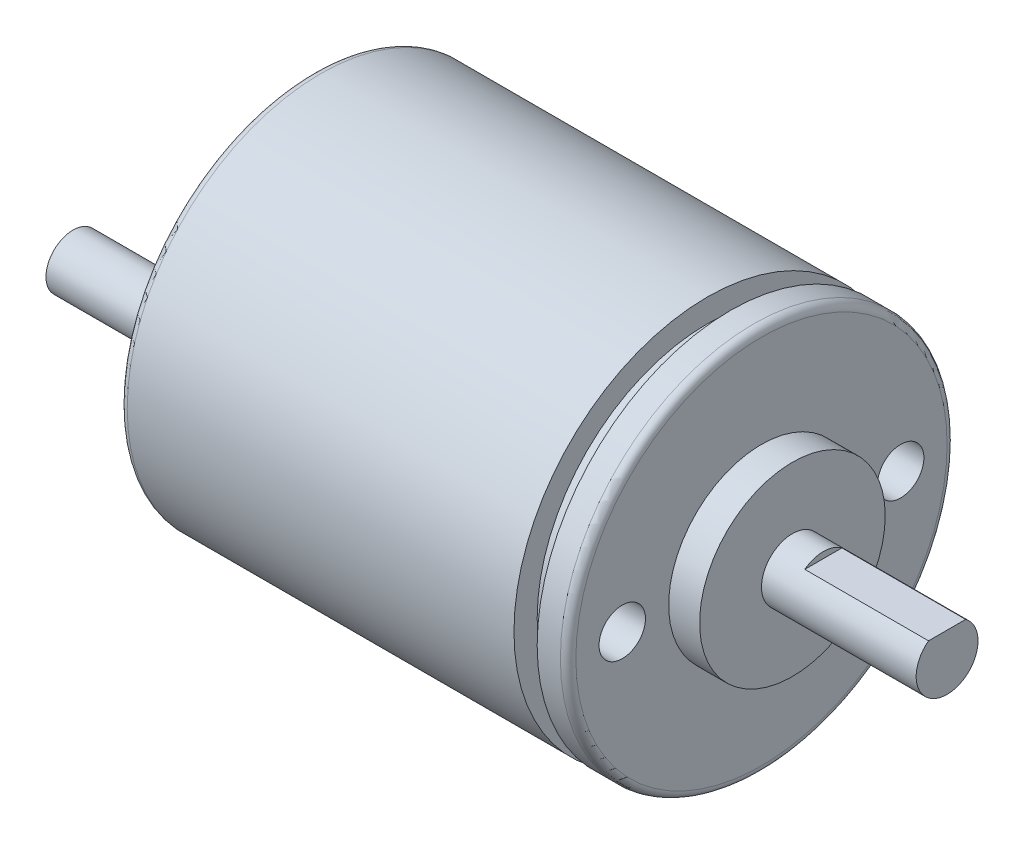
ISO-10303-21;
HEADER;
FILE_DESCRIPTION(('STEP AP214'),'2;1');
FILE_NAME('part.step','',(''),(''),'','','');
FILE_SCHEMA(('AUTOMOTIVE_DESIGN { 1 0 10303 214 1 1 1 1 }'));
ENDSEC;
DATA;
#1=APPLICATION_CONTEXT('core data for automotive mechanical design processes');
#2=APPLICATION_PROTOCOL_DEFINITION('international standard','automotive_design',2000,#1);
#3=PRODUCT_CONTEXT('',#1,'mechanical');
#4=PRODUCT('Part','Part','',(#3));
#5=PRODUCT_RELATED_PRODUCT_CATEGORY('part','',(#4));
#6=PRODUCT_DEFINITION_FORMATION('','',#4);
#7=PRODUCT_DEFINITION_CONTEXT('part definition',#1,'design');
#8=PRODUCT_DEFINITION('design','',#6,#7);
#9=PRODUCT_DEFINITION_SHAPE('','',#8);
#10=(LENGTH_UNIT() NAMED_UNIT(*) SI_UNIT(.MILLI.,.METRE.));
#11=(NAMED_UNIT(*) PLANE_ANGLE_UNIT() SI_UNIT($,.RADIAN.));
#12=(NAMED_UNIT(*) SI_UNIT($,.STERADIAN.) SOLID_ANGLE_UNIT());
#13=UNCERTAINTY_MEASURE_WITH_UNIT(LENGTH_MEASURE(1.E-05),#10,'distance_accuracy_value','');
#14=(GEOMETRIC_REPRESENTATION_CONTEXT(3) GLOBAL_UNCERTAINTY_ASSIGNED_CONTEXT((#13)) GLOBAL_UNIT_ASSIGNED_CONTEXT((#10,
#11,#12)) REPRESENTATION_CONTEXT('',''));
#15=CARTESIAN_POINT('',(0.,0.,0.));
#16=DIRECTION('',(0.,0.,1.));
#17=DIRECTION('',(1.,0.,0.));
#18=AXIS2_PLACEMENT_3D('',#15,#16,#17);
#19=CARTESIAN_POINT('',(29.,0.,0.));
#20=DIRECTION('',(-1.,0.,0.));
#21=DIRECTION('',(0.,0.,1.));
#22=AXIS2_PLACEMENT_3D('',#19,#20,#21);
#23=CYLINDRICAL_SURFACE('',#22,12.5);
#24=CARTESIAN_POINT('',(0.5,0.,0.));
#25=DIRECTION('',(1.,0.,0.));
#26=DIRECTION('',(0.,0.,-1.));
#27=AXIS2_PLACEMENT_3D('',#24,#25,#26);
#28=CIRCLE('',#27,12.5);
#29=CARTESIAN_POINT('',(0.5,0.,12.5));
#30=VERTEX_POINT('',#29);
#31=EDGE_CURVE('E126',#30,#30,#28,.T.);
#32=CARTESIAN_POINT('',(25.5,0.,0.));
#33=DIRECTION('',(1.,0.,0.));
#34=DIRECTION('',(0.,0.,-1.));
#35=AXIS2_PLACEMENT_3D('',#32,#33,#34);
#36=CIRCLE('',#35,12.5);
#37=CARTESIAN_POINT('',(25.5,0.,12.5));
#38=VERTEX_POINT('',#37);
#39=EDGE_CURVE('E111',#38,#38,#36,.T.);
#40=CARTESIAN_POINT('',(0.5,0.,12.5));
#41=CARTESIAN_POINT('',(0.760416666666667,0.,12.5));
#42=CARTESIAN_POINT('',(1.02083333333333,0.,12.5));
#43=CARTESIAN_POINT('',(1.54166666666667,0.,12.5));
#44=CARTESIAN_POINT('',(1.80208333333334,0.,12.5));
#45=CARTESIAN_POINT('',(2.32291666666667,0.,12.5));
#46=CARTESIAN_POINT('',(2.58333333333333,0.,12.5));
#47=CARTESIAN_POINT('',(3.10416666666667,0.,12.5));
#48=CARTESIAN_POINT('',(3.36458333333333,0.,12.5));
#49=CARTESIAN_POINT('',(3.88541666666667,0.,12.5));
#50=CARTESIAN_POINT('',(4.14583333333333,0.,12.5));
#51=CARTESIAN_POINT('',(4.66666666666667,0.,12.5));
#52=CARTESIAN_POINT('',(4.92708333333333,0.,12.5));
#53=CARTESIAN_POINT('',(5.44791666666667,0.,12.5));
#54=CARTESIAN_POINT('',(5.70833333333333,0.,12.5));
#55=CARTESIAN_POINT('',(6.22916666666667,0.,12.5));
#56=CARTESIAN_POINT('',(6.48958333333333,0.,12.5));
#57=CARTESIAN_POINT('',(7.01041666666667,0.,12.5));
#58=CARTESIAN_POINT('',(7.27083333333333,0.,12.5));
#59=CARTESIAN_POINT('',(7.79166666666667,0.,12.5));
#60=CARTESIAN_POINT('',(8.05208333333333,0.,12.5));
#61=CARTESIAN_POINT('',(8.57291666666667,0.,12.5));
#62=CARTESIAN_POINT('',(8.83333333333333,0.,12.5));
#63=CARTESIAN_POINT('',(9.35416666666667,0.,12.5));
#64=CARTESIAN_POINT('',(9.61458333333333,0.,12.5));
#65=CARTESIAN_POINT('',(10.1354166666667,0.,12.5));
#66=CARTESIAN_POINT('',(10.3958333333333,0.,12.5));
#67=CARTESIAN_POINT('',(10.9166666666667,0.,12.5));
#68=CARTESIAN_POINT('',(11.1770833333333,0.,12.5));
#69=CARTESIAN_POINT('',(11.6979166666667,0.,12.5));
#70=CARTESIAN_POINT('',(11.9583333333333,0.,12.5));
#71=CARTESIAN_POINT('',(12.4791666666667,0.,12.5));
#72=CARTESIAN_POINT('',(12.7395833333333,0.,12.5));
#73=CARTESIAN_POINT('',(13.2604166666667,0.,12.5));
#74=CARTESIAN_POINT('',(13.5208333333333,0.,12.5));
#75=CARTESIAN_POINT('',(14.0416666666667,0.,12.5));
#76=CARTESIAN_POINT('',(14.3020833333333,0.,12.5));
#77=CARTESIAN_POINT('',(14.8229166666667,0.,12.5));
#78=CARTESIAN_POINT('',(15.0833333333333,0.,12.5));
#79=CARTESIAN_POINT('',(15.6041666666667,0.,12.5));
#80=CARTESIAN_POINT('',(15.8645833333333,0.,12.5));
#81=CARTESIAN_POINT('',(16.3854166666667,0.,12.5));
#82=CARTESIAN_POINT('',(16.6458333333333,0.,12.5));
#83=CARTESIAN_POINT('',(17.1666666666667,0.,12.5));
#84=CARTESIAN_POINT('',(17.4270833333333,0.,12.5));
#85=CARTESIAN_POINT('',(17.9479166666667,0.,12.5));
#86=CARTESIAN_POINT('',(18.2083333333333,0.,12.5));
#87=CARTESIAN_POINT('',(18.7291666666667,0.,12.5));
#88=CARTESIAN_POINT('',(18.9895833333333,0.,12.5));
#89=CARTESIAN_POINT('',(19.5104166666667,0.,12.5));
#90=CARTESIAN_POINT('',(19.7708333333333,0.,12.5));
#91=CARTESIAN_POINT('',(20.2916666666667,0.,12.5));
#92=CARTESIAN_POINT('',(20.5520833333333,0.,12.5));
#93=CARTESIAN_POINT('',(21.0729166666667,0.,12.5));
#94=CARTESIAN_POINT('',(21.3333333333333,0.,12.5));
#95=CARTESIAN_POINT('',(21.8541666666667,0.,12.5));
#96=CARTESIAN_POINT('',(22.1145833333333,0.,12.5));
#97=CARTESIAN_POINT('',(22.6354166666667,0.,12.5));
#98=CARTESIAN_POINT('',(22.8958333333333,0.,12.5));
#99=CARTESIAN_POINT('',(23.4166666666667,0.,12.5));
#100=CARTESIAN_POINT('',(23.6770833333333,0.,12.5));
#101=CARTESIAN_POINT('',(24.1979166666667,0.,12.5));
#102=CARTESIAN_POINT('',(24.4583333333333,0.,12.5));
#103=CARTESIAN_POINT('',(24.9791666666667,0.,12.5));
#104=CARTESIAN_POINT('',(25.2395833333333,0.,12.5));
#105=CARTESIAN_POINT('',(25.5,0.,12.5));
#106=B_SPLINE_CURVE_WITH_KNOTS('',3,(#40,#41,#42,#43,#44,#45,#46,#47,#48,#49,#50,#51,#52,#53,
#54,#55,#56,#57,#58,#59,#60,#61,#62,#63,#64,#65,#66,#67,#68,#69,#70,#71,#72,#73,#74,#75,#76,#77,
#78,#79,#80,#81,#82,#83,#84,#85,#86,#87,#88,#89,#90,#91,#92,#93,#94,#95,#96,#97,#98,#99,#100,
#101,#102,#103,#104,#105),.UNSPECIFIED.,.F.,.F.,(4,2,2,2,2,2,2,2,2,2,2,2,2,2,2,2,2,2,2,2,2,2,2,
2,2,2,2,2,2,2,2,2,4),(0.,0.781250000000001,1.5625,2.34375,3.125,3.90625,4.6875,5.46875,6.25,
7.03125,7.8125,8.59375,9.375,10.15625,10.9375,11.71875,12.5,13.28125,14.0625,14.84375,15.625,
16.40625,17.1875,17.96875,18.75,19.53125,20.3125,21.09375,21.875,22.65625,23.4375,24.21875,25.),.UNSPECIFIED.);
#107=EDGE_CURVE('BSEAM40',#30,#38,#106,.T.);
#108=ORIENTED_EDGE('',*,*,#31,.T.);
#109=ORIENTED_EDGE('',*,*,#39,.F.);
#110=ORIENTED_EDGE('',*,*,#107,.T.);
#111=ORIENTED_EDGE('',*,*,#107,.F.);
#112=EDGE_LOOP('',(#108,#110,#109,#111));
#113=FACE_BOUND('',#112,.T.);
#114=ADVANCED_FACE('F40',(#113),#23,.T.);
#115=CARTESIAN_POINT('',(0.,0.,0.));
#116=DIRECTION('',(1.,0.,0.));
#117=DIRECTION('',(0.,0.,-1.));
#118=AXIS2_PLACEMENT_3D('',#115,#116,#117);
#119=PLANE('',#118);
#120=CARTESIAN_POINT('',(0.,-6.,0.));
#121=DIRECTION('',(1.,0.,0.));
#122=DIRECTION('',(0.,0.,-1.));
#123=AXIS2_PLACEMENT_3D('',#120,#121,#122);
#124=CIRCLE('',#123,4.);
#125=CARTESIAN_POINT('',(0.,-6.,-4.));
#126=VERTEX_POINT('',#125);
#127=EDGE_CURVE('E44',#126,#126,#124,.F.);
#128=ORIENTED_EDGE('',*,*,#127,.F.);
#129=EDGE_LOOP('',(#128));
#130=FACE_BOUND('',#129,.T.);
#131=CARTESIAN_POINT('',(0.,0.,0.));
#132=DIRECTION('',(1.,0.,0.));
#133=DIRECTION('',(0.,0.,-1.));
#134=AXIS2_PLACEMENT_3D('',#131,#132,#133);
#135=CIRCLE('',#134,12.);
#136=CARTESIAN_POINT('',(0.,0.,-12.));
#137=VERTEX_POINT('',#136);
#138=EDGE_CURVE('E98',#137,#137,#135,.F.);
#139=ORIENTED_EDGE('',*,*,#138,.T.);
#140=EDGE_LOOP('',(#139));
#141=FACE_BOUND('',#140,.T.);
#142=ADVANCED_FACE('F133',(#130,#141),#119,.F.);
#143=CARTESIAN_POINT('',(25.5,0.,0.));
#144=DIRECTION('',(1.,0.,0.));
#145=DIRECTION('',(0.,0.,-1.));
#146=AXIS2_PLACEMENT_3D('',#143,#144,#145);
#147=PLANE('',#146);
#148=CARTESIAN_POINT('',(25.5,0.,0.));
#149=DIRECTION('',(1.,0.,0.));
#150=DIRECTION('',(0.,0.,-1.));
#151=AXIS2_PLACEMENT_3D('',#148,#149,#150);
#152=CIRCLE('',#151,11.);
#153=CARTESIAN_POINT('',(25.5,0.,-11.));
#154=VERTEX_POINT('',#153);
#155=EDGE_CURVE('E103',#154,#154,#152,.T.);
#156=ORIENTED_EDGE('',*,*,#155,.F.);
#157=EDGE_LOOP('',(#156));
#158=FACE_BOUND('',#157,.T.);
#159=ORIENTED_EDGE('',*,*,#39,.T.);
#160=EDGE_LOOP('',(#159));
#161=FACE_BOUND('',#160,.T.);
#162=ADVANCED_FACE('F147',(#158,#161),#147,.T.);
#163=CARTESIAN_POINT('',(27.,0.,0.));
#164=DIRECTION('',(1.,0.,0.));
#165=DIRECTION('',(0.,0.,-1.));
#166=AXIS2_PLACEMENT_3D('',#163,#164,#165);
#167=PLANE('',#166);
#168=CARTESIAN_POINT('',(27.,0.,0.));
#169=DIRECTION('',(1.,0.,0.));
#170=DIRECTION('',(0.,0.,-1.));
#171=AXIS2_PLACEMENT_3D('',#168,#169,#170);
#172=CIRCLE('',#171,11.);
#173=CARTESIAN_POINT('',(27.,0.,-11.));
#174=VERTEX_POINT('',#173);
#175=EDGE_CURVE('E101',#174,#174,#172,.T.);
#176=ORIENTED_EDGE('',*,*,#175,.T.);
#177=EDGE_LOOP('',(#176));
#178=FACE_BOUND('',#177,.T.);
#179=CARTESIAN_POINT('',(27.,0.,0.));
#180=DIRECTION('',(1.,0.,0.));
#181=DIRECTION('',(0.,0.,-1.));
#182=AXIS2_PLACEMENT_3D('',#179,#180,#181);
#183=CIRCLE('',#182,12.5);
#184=CARTESIAN_POINT('',(27.,0.,12.5));
#185=VERTEX_POINT('',#184);
#186=EDGE_CURVE('E107',#185,#185,#183,.T.);
#187=ORIENTED_EDGE('',*,*,#186,.F.);
#188=EDGE_LOOP('',(#187));
#189=FACE_BOUND('',#188,.T.);
#190=ADVANCED_FACE('F149',(#178,#189),#167,.F.);
#191=CARTESIAN_POINT('',(25.5,0.,0.));
#192=DIRECTION('',(1.,0.,0.));
#193=DIRECTION('',(0.,0.,-1.));
#194=AXIS2_PLACEMENT_3D('',#191,#192,#193);
#195=CYLINDRICAL_SURFACE('',#194,11.);
#196=ORIENTED_EDGE('',*,*,#155,.T.);
#197=EDGE_LOOP('',(#196));
#198=FACE_BOUND('',#197,.T.);
#199=ORIENTED_EDGE('',*,*,#175,.F.);
#200=EDGE_LOOP('',(#199));
#201=FACE_BOUND('',#200,.T.);
#202=ADVANCED_FACE('F156',(#198,#201),#195,.T.);
#203=CARTESIAN_POINT('',(29.,0.,0.));
#204=DIRECTION('',(1.,0.,0.));
#205=DIRECTION('',(0.,0.,-1.));
#206=AXIS2_PLACEMENT_3D('',#203,#204,#205);
#207=PLANE('',#206);
#208=CARTESIAN_POINT('',(29.,0.,9.));
#209=DIRECTION('',(1.,0.,0.));
#210=DIRECTION('',(0.,0.,-1.));
#211=AXIS2_PLACEMENT_3D('',#208,#209,#210);
#212=CIRCLE('',#211,1.5);
#213=CARTESIAN_POINT('',(29.,0.,7.5));
#214=VERTEX_POINT('',#213);
#215=EDGE_CURVE('E386',#214,#214,#212,.T.);
#216=ORIENTED_EDGE('',*,*,#215,.F.);
#217=EDGE_LOOP('',(#216));
#218=FACE_BOUND('',#217,.T.);
#219=CARTESIAN_POINT('',(29.,0.,-9.));
#220=DIRECTION('',(1.,0.,0.));
#221=DIRECTION('',(0.,0.,1.));
#222=AXIS2_PLACEMENT_3D('',#219,#220,#221);
#223=CIRCLE('',#222,1.5);
#224=CARTESIAN_POINT('',(29.,0.,-7.5));
#225=VERTEX_POINT('',#224);
#226=EDGE_CURVE('E399',#225,#225,#223,.T.);
#227=ORIENTED_EDGE('',*,*,#226,.F.);
#228=EDGE_LOOP('',(#227));
#229=FACE_BOUND('',#228,.T.);
#230=CARTESIAN_POINT('',(29.,0.,0.));
#231=DIRECTION('',(1.,0.,0.));
#232=DIRECTION('',(0.,0.,-1.));
#233=AXIS2_PLACEMENT_3D('',#230,#231,#232);
#234=CIRCLE('',#233,6.);
#235=CARTESIAN_POINT('',(29.,0.,-6.));
#236=VERTEX_POINT('',#235);
#237=EDGE_CURVE('E86',#236,#236,#234,.T.);
#238=ORIENTED_EDGE('',*,*,#237,.F.);
#239=EDGE_LOOP('',(#238));
#240=FACE_BOUND('',#239,.T.);
#241=CARTESIAN_POINT('',(29.,0.,0.));
#242=DIRECTION('',(1.,0.,0.));
#243=DIRECTION('',(0.,0.,-1.));
#244=AXIS2_PLACEMENT_3D('',#241,#242,#243);
#245=CIRCLE('',#244,12.);
#246=CARTESIAN_POINT('',(29.,0.,-12.));
#247=VERTEX_POINT('',#246);
#248=EDGE_CURVE('E115',#247,#247,#245,.T.);
#249=ORIENTED_EDGE('',*,*,#248,.T.);
#250=EDGE_LOOP('',(#249));
#251=FACE_BOUND('',#250,.T.);
#252=ADVANCED_FACE('F165',(#218,#229,#240,#251),#207,.T.);
#253=CARTESIAN_POINT('',(28.5,0.,0.));
#254=DIRECTION('',(1.,0.,0.));
#255=DIRECTION('',(0.,0.,-1.));
#256=AXIS2_PLACEMENT_3D('',#253,#254,#255);
#257=CIRCLE('',#256,12.5);
#258=CARTESIAN_POINT('',(28.5,0.,12.5));
#259=VERTEX_POINT('',#258);
#260=EDGE_CURVE('E122',#259,#259,#257,.F.);
#261=CARTESIAN_POINT('',(28.5,0.,12.5));
#262=CARTESIAN_POINT('',(28.484375,0.,12.5));
#263=CARTESIAN_POINT('',(28.46875,0.,12.5));
#264=CARTESIAN_POINT('',(28.4375,0.,12.5));
#265=CARTESIAN_POINT('',(28.421875,0.,12.5));
#266=CARTESIAN_POINT('',(28.390625,0.,12.5));
#267=CARTESIAN_POINT('',(28.375,0.,12.5));
#268=CARTESIAN_POINT('',(28.34375,0.,12.5));
#269=CARTESIAN_POINT('',(28.328125,0.,12.5));
#270=CARTESIAN_POINT('',(28.296875,0.,12.5));
#271=CARTESIAN_POINT('',(28.28125,0.,12.5));
#272=CARTESIAN_POINT('',(28.25,0.,12.5));
#273=CARTESIAN_POINT('',(28.234375,0.,12.5));
#274=CARTESIAN_POINT('',(28.203125,0.,12.5));
#275=CARTESIAN_POINT('',(28.1875,0.,12.5));
#276=CARTESIAN_POINT('',(28.15625,0.,12.5));
#277=CARTESIAN_POINT('',(28.140625,0.,12.5));
#278=CARTESIAN_POINT('',(28.109375,0.,12.5));
#279=CARTESIAN_POINT('',(28.09375,0.,12.5));
#280=CARTESIAN_POINT('',(28.0625,0.,12.5));
#281=CARTESIAN_POINT('',(28.046875,0.,12.5));
#282=CARTESIAN_POINT('',(28.015625,0.,12.5));
#283=CARTESIAN_POINT('',(28.,0.,12.5));
#284=CARTESIAN_POINT('',(27.96875,0.,12.5));
#285=CARTESIAN_POINT('',(27.953125,0.,12.5));
#286=CARTESIAN_POINT('',(27.921875,0.,12.5));
#287=CARTESIAN_POINT('',(27.90625,0.,12.5));
#288=CARTESIAN_POINT('',(27.875,0.,12.5));
#289=CARTESIAN_POINT('',(27.859375,0.,12.5));
#290=CARTESIAN_POINT('',(27.828125,0.,12.5));
#291=CARTESIAN_POINT('',(27.8125,0.,12.5));
#292=CARTESIAN_POINT('',(27.78125,0.,12.5));
#293=CARTESIAN_POINT('',(27.765625,0.,12.5));
#294=CARTESIAN_POINT('',(27.734375,0.,12.5));
#295=CARTESIAN_POINT('',(27.71875,0.,12.5));
#296=CARTESIAN_POINT('',(27.6875,0.,12.5));
#297=CARTESIAN_POINT('',(27.671875,0.,12.5));
#298=CARTESIAN_POINT('',(27.640625,0.,12.5));
#299=CARTESIAN_POINT('',(27.625,0.,12.5));
#300=CARTESIAN_POINT('',(27.59375,0.,12.5));
#301=CARTESIAN_POINT('',(27.578125,0.,12.5));
#302=CARTESIAN_POINT('',(27.546875,0.,12.5));
#303=CARTESIAN_POINT('',(27.53125,0.,12.5));
#304=CARTESIAN_POINT('',(27.5,0.,12.5));
#305=CARTESIAN_POINT('',(27.484375,0.,12.5));
#306=CARTESIAN_POINT('',(27.453125,0.,12.5));
#307=CARTESIAN_POINT('',(27.4375,0.,12.5));
#308=CARTESIAN_POINT('',(27.40625,0.,12.5));
#309=CARTESIAN_POINT('',(27.390625,0.,12.5));
#310=CARTESIAN_POINT('',(27.359375,0.,12.5));
#311=CARTESIAN_POINT('',(27.34375,0.,12.5));
#312=CARTESIAN_POINT('',(27.3125,0.,12.5));
#313=CARTESIAN_POINT('',(27.296875,0.,12.5));
#314=CARTESIAN_POINT('',(27.265625,0.,12.5));
#315=CARTESIAN_POINT('',(27.25,0.,12.5));
#316=CARTESIAN_POINT('',(27.21875,0.,12.5));
#317=CARTESIAN_POINT('',(27.203125,0.,12.5));
#318=CARTESIAN_POINT('',(27.171875,0.,12.5));
#319=CARTESIAN_POINT('',(27.15625,0.,12.5));
#320=CARTESIAN_POINT('',(27.125,0.,12.5));
#321=CARTESIAN_POINT('',(27.109375,0.,12.5));
#322=CARTESIAN_POINT('',(27.078125,0.,12.5));
#323=CARTESIAN_POINT('',(27.0625,0.,12.5));
#324=CARTESIAN_POINT('',(27.03125,0.,12.5));
#325=CARTESIAN_POINT('',(27.015625,0.,12.5));
#326=CARTESIAN_POINT('',(27.,0.,12.5));
#327=B_SPLINE_CURVE_WITH_KNOTS('',3,(#261,#262,#263,#264,#265,#266,#267,#268,#269,#270,#271,
#272,#273,#274,#275,#276,#277,#278,#279,#280,#281,#282,#283,#284,#285,#286,#287,#288,#289,#290,
#291,#292,#293,#294,#295,#296,#297,#298,#299,#300,#301,#302,#303,#304,#305,#306,#307,#308,#309,
#310,#311,#312,#313,#314,#315,#316,#317,#318,#319,#320,#321,#322,#323,#324,#325,#326),
.UNSPECIFIED.,.F.,.F.,(4,2,2,2,2,2,2,2,2,2,2,2,2,2,2,2,2,2,2,2,2,2,2,2,2,2,2,2,2,2,2,2,4),(0.,
0.0468750000000018,0.0937500000000001,0.140625000000002,0.1875,0.234375000000002,0.28125,
0.328125000000002,0.375,0.421875000000002,0.46875,0.515625000000002,0.5625,0.609375000000002,
0.656250000000001,0.703125000000002,0.750000000000001,0.796875000000002,0.843750000000001,
0.890625000000003,0.937500000000001,0.984374999999999,1.03125,1.078125,1.125,1.171875,1.21875,
1.265625,1.3125,1.359375,1.40625,1.453125,1.5),.UNSPECIFIED.);
#328=EDGE_CURVE('BSEAM144',#259,#185,#327,.T.);
#329=ORIENTED_EDGE('',*,*,#260,.T.);
#330=ORIENTED_EDGE('',*,*,#186,.T.);
#331=ORIENTED_EDGE('',*,*,#328,.T.);
#332=ORIENTED_EDGE('',*,*,#328,.F.);
#333=EDGE_LOOP('',(#329,#331,#330,#332));
#334=FACE_BOUND('',#333,.T.);
#335=ADVANCED_FACE('F144',(#334),#23,.T.);
#336=CARTESIAN_POINT('',(28.5,0.,0.));
#337=DIRECTION('',(1.,0.,0.));
#338=DIRECTION('',(0.,0.,-1.));
#339=AXIS2_PLACEMENT_3D('',#336,#337,#338);
#340=TOROIDAL_SURFACE('',#339,12.,0.5);
#341=ORIENTED_EDGE('',*,*,#260,.F.);
#342=EDGE_LOOP('',(#341));
#343=FACE_BOUND('',#342,.T.);
#344=ORIENTED_EDGE('',*,*,#248,.F.);
#345=EDGE_LOOP('',(#344));
#346=FACE_BOUND('',#345,.T.);
#347=ADVANCED_FACE('F138',(#343,#346),#340,.T.);
#348=CARTESIAN_POINT('',(0.5,0.,0.));
#349=DIRECTION('',(1.,0.,0.));
#350=DIRECTION('',(0.,0.,-1.));
#351=AXIS2_PLACEMENT_3D('',#348,#349,#350);
#352=TOROIDAL_SURFACE('',#351,12.,0.5);
#353=ORIENTED_EDGE('',*,*,#138,.F.);
#354=EDGE_LOOP('',(#353));
#355=FACE_BOUND('',#354,.T.);
#356=ORIENTED_EDGE('',*,*,#31,.F.);
#357=EDGE_LOOP('',(#356));
#358=FACE_BOUND('',#357,.T.);
#359=ADVANCED_FACE('F42',(#355,#358),#352,.T.);
#360=CARTESIAN_POINT('',(31.,0.,0.));
#361=DIRECTION('',(-1.,0.,0.));
#362=DIRECTION('',(0.,0.,1.));
#363=AXIS2_PLACEMENT_3D('',#360,#361,#362);
#364=CYLINDRICAL_SURFACE('',#363,6.);
#365=CARTESIAN_POINT('',(31.,0.,0.));
#366=DIRECTION('',(1.,0.,0.));
#367=DIRECTION('',(0.,0.,-1.));
#368=AXIS2_PLACEMENT_3D('',#365,#366,#367);
#369=CIRCLE('',#368,6.);
#370=CARTESIAN_POINT('',(31.,0.,-6.));
#371=VERTEX_POINT('',#370);
#372=EDGE_CURVE('E90',#371,#371,#369,.T.);
#373=ORIENTED_EDGE('',*,*,#372,.F.);
#374=EDGE_LOOP('',(#373));
#375=FACE_BOUND('',#374,.T.);
#376=ORIENTED_EDGE('',*,*,#237,.T.);
#377=EDGE_LOOP('',(#376));
#378=FACE_BOUND('',#377,.T.);
#379=ADVANCED_FACE('F137',(#375,#378),#364,.T.);
#380=CARTESIAN_POINT('',(31.,0.,0.));
#381=DIRECTION('',(1.,0.,0.));
#382=DIRECTION('',(0.,0.,-1.));
#383=AXIS2_PLACEMENT_3D('',#380,#381,#382);
#384=PLANE('',#383);
#385=CARTESIAN_POINT('',(31.,0.,0.));
#386=DIRECTION('',(1.,0.,0.));
#387=DIRECTION('',(0.,0.,-1.));
#388=AXIS2_PLACEMENT_3D('',#385,#386,#387);
#389=CIRCLE('',#388,2.);
#390=CARTESIAN_POINT('',(31.,0.,-2.));
#391=VERTEX_POINT('',#390);
#392=EDGE_CURVE('E94',#391,#391,#389,.T.);
#393=ORIENTED_EDGE('',*,*,#392,.F.);
#394=EDGE_LOOP('',(#393));
#395=FACE_BOUND('',#394,.T.);
#396=ORIENTED_EDGE('',*,*,#372,.T.);
#397=EDGE_LOOP('',(#396));
#398=FACE_BOUND('',#397,.T.);
#399=ADVANCED_FACE('F196',(#395,#398),#384,.T.);
#400=CARTESIAN_POINT('',(41.,0.,0.));
#401=DIRECTION('',(-1.,0.,0.));
#402=DIRECTION('',(0.,0.,1.));
#403=AXIS2_PLACEMENT_3D('',#400,#401,#402);
#404=CYLINDRICAL_SURFACE('',#403,2.);
#405=CARTESIAN_POINT('',(41.,0.,0.));
#406=DIRECTION('',(1.,0.,0.));
#407=DIRECTION('',(0.,0.,-1.));
#408=AXIS2_PLACEMENT_3D('',#405,#406,#407);
#409=CIRCLE('',#408,2.);
#410=CARTESIAN_POINT('',(41.,1.6,1.2));
#411=VERTEX_POINT('',#410);
#412=CARTESIAN_POINT('',(41.,1.6,-1.2));
#413=VERTEX_POINT('',#412);
#414=EDGE_CURVE('E81',#411,#413,#409,.T.);
#415=ORIENTED_EDGE('',*,*,#414,.F.);
#416=DIRECTION('',(1.,0.,0.));
#417=VECTOR('',#416,1.);
#418=CARTESIAN_POINT('',(33.,1.6,1.2));
#419=LINE('',#418,#417);
#420=CARTESIAN_POINT('',(33.,1.6,1.2));
#421=VERTEX_POINT('',#420);
#422=EDGE_CURVE('E57',#421,#411,#419,.T.);
#423=ORIENTED_EDGE('',*,*,#422,.F.);
#424=CARTESIAN_POINT('',(33.,0.,0.));
#425=DIRECTION('',(1.,0.,0.));
#426=DIRECTION('',(0.,0.,-1.));
#427=AXIS2_PLACEMENT_3D('',#424,#425,#426);
#428=CIRCLE('',#427,2.);
#429=CARTESIAN_POINT('',(33.,1.6,-1.2));
#430=VERTEX_POINT('',#429);
#431=EDGE_CURVE('E74',#430,#421,#428,.T.);
#432=ORIENTED_EDGE('',*,*,#431,.F.);
#433=DIRECTION('',(1.,0.,0.));
#434=VECTOR('',#433,1.);
#435=CARTESIAN_POINT('',(33.,1.6,-1.2));
#436=LINE('',#435,#434);
#437=EDGE_CURVE('E63',#430,#413,#436,.T.);
#438=ORIENTED_EDGE('',*,*,#437,.T.);
#439=EDGE_LOOP('',(#415,#423,#432,#438));
#440=FACE_BOUND('',#439,.T.);
#441=ORIENTED_EDGE('',*,*,#392,.T.);
#442=EDGE_LOOP('',(#441));
#443=FACE_BOUND('',#442,.T.);
#444=ADVANCED_FACE('F79',(#440,#443),#404,.T.);
#445=CARTESIAN_POINT('',(41.,0.,0.));
#446=DIRECTION('',(1.,0.,0.));
#447=DIRECTION('',(0.,0.,-1.));
#448=AXIS2_PLACEMENT_3D('',#445,#446,#447);
#449=PLANE('',#448);
#450=DIRECTION('',(0.,0.,-1.));
#451=VECTOR('',#450,1.);
#452=CARTESIAN_POINT('',(41.,1.6,1.2));
#453=LINE('',#452,#451);
#454=EDGE_CURVE('E68',#411,#413,#453,.T.);
#455=ORIENTED_EDGE('',*,*,#454,.F.);
#456=ORIENTED_EDGE('',*,*,#414,.T.);
#457=EDGE_LOOP('',(#455,#456));
#458=FACE_BOUND('',#457,.T.);
#459=ADVANCED_FACE('F84',(#458),#449,.T.);
#460=CARTESIAN_POINT('',(33.,1.6,1.2));
#461=DIRECTION('',(0.,-1.,0.));
#462=DIRECTION('',(0.,0.,-1.));
#463=AXIS2_PLACEMENT_3D('',#460,#461,#462);
#464=PLANE('',#463);
#465=ORIENTED_EDGE('',*,*,#454,.T.);
#466=ORIENTED_EDGE('',*,*,#437,.F.);
#467=DIRECTION('',(0.,0.,-1.));
#468=VECTOR('',#467,1.);
#469=CARTESIAN_POINT('',(33.,1.6,1.2));
#470=LINE('',#469,#468);
#471=EDGE_CURVE('E408',#421,#430,#470,.T.);
#472=ORIENTED_EDGE('',*,*,#471,.F.);
#473=ORIENTED_EDGE('',*,*,#422,.T.);
#474=EDGE_LOOP('',(#465,#466,#472,#473));
#475=FACE_BOUND('',#474,.T.);
#476=ADVANCED_FACE('F69',(#475),#464,.F.);
#477=CARTESIAN_POINT('',(33.,0.,0.));
#478=DIRECTION('',(1.,0.,0.));
#479=DIRECTION('',(0.,0.,-1.));
#480=AXIS2_PLACEMENT_3D('',#477,#478,#479);
#481=PLANE('',#480);
#482=ORIENTED_EDGE('',*,*,#431,.T.);
#483=ORIENTED_EDGE('',*,*,#471,.T.);
#484=EDGE_LOOP('',(#482,#483));
#485=FACE_BOUND('',#484,.T.);
#486=ADVANCED_FACE('F222',(#485),#481,.T.);
#487=CARTESIAN_POINT('',(-5.5,-6.,0.));
#488=DIRECTION('',(1.,0.,0.));
#489=DIRECTION('',(0.,0.,-1.));
#490=AXIS2_PLACEMENT_3D('',#487,#488,#489);
#491=CYLINDRICAL_SURFACE('',#490,4.);
#492=CARTESIAN_POINT('',(-5.5,-6.,0.));
#493=DIRECTION('',(-1.,0.,0.));
#494=DIRECTION('',(0.,0.,1.));
#495=AXIS2_PLACEMENT_3D('',#492,#493,#494);
#496=CIRCLE('',#495,4.);
#497=CARTESIAN_POINT('',(-5.5,-6.,4.));
#498=VERTEX_POINT('',#497);
#499=EDGE_CURVE('E75',#498,#498,#496,.T.);
#500=ORIENTED_EDGE('',*,*,#499,.F.);
#501=EDGE_LOOP('',(#500));
#502=FACE_BOUND('',#501,.T.);
#503=ORIENTED_EDGE('',*,*,#127,.T.);
#504=EDGE_LOOP('',(#503));
#505=FACE_BOUND('',#504,.T.);
#506=ADVANCED_FACE('F229',(#502,#505),#491,.T.);
#507=CARTESIAN_POINT('',(-5.5,-6.,0.));
#508=DIRECTION('',(-1.,0.,0.));
#509=DIRECTION('',(0.,0.,1.));
#510=AXIS2_PLACEMENT_3D('',#507,#508,#509);
#511=PLANE('',#510);
#512=CARTESIAN_POINT('',(-5.5,-6.,0.));
#513=DIRECTION('',(-1.,0.,0.));
#514=DIRECTION('',(0.,0.,1.));
#515=AXIS2_PLACEMENT_3D('',#512,#513,#514);
#516=CIRCLE('',#515,1.75);
#517=CARTESIAN_POINT('',(-5.5,-6.,1.75));
#518=VERTEX_POINT('',#517);
#519=EDGE_CURVE('E11',#518,#518,#516,.T.);
#520=ORIENTED_EDGE('',*,*,#519,.F.);
#521=EDGE_LOOP('',(#520));
#522=FACE_BOUND('',#521,.T.);
#523=ORIENTED_EDGE('',*,*,#499,.T.);
#524=EDGE_LOOP('',(#523));
#525=FACE_BOUND('',#524,.T.);
#526=ADVANCED_FACE('F238',(#522,#525),#511,.T.);
#527=CARTESIAN_POINT('',(-15.5,-6.,0.));
#528=DIRECTION('',(1.,0.,0.));
#529=DIRECTION('',(0.,0.,-1.));
#530=AXIS2_PLACEMENT_3D('',#527,#528,#529);
#531=CYLINDRICAL_SURFACE('',#530,1.75);
#532=CARTESIAN_POINT('',(-15.5,-6.,0.));
#533=DIRECTION('',(-1.,0.,0.));
#534=DIRECTION('',(0.,0.,1.));
#535=AXIS2_PLACEMENT_3D('',#532,#533,#534);
#536=CIRCLE('',#535,1.75);
#537=CARTESIAN_POINT('',(-15.5,-6.,1.75));
#538=VERTEX_POINT('',#537);
#539=EDGE_CURVE('E385',#538,#538,#536,.T.);
#540=ORIENTED_EDGE('',*,*,#539,.F.);
#541=EDGE_LOOP('',(#540));
#542=FACE_BOUND('',#541,.T.);
#543=ORIENTED_EDGE('',*,*,#519,.T.);
#544=EDGE_LOOP('',(#543));
#545=FACE_BOUND('',#544,.T.);
#546=ADVANCED_FACE('F246',(#542,#545),#531,.T.);
#547=CARTESIAN_POINT('',(-15.5,-6.,0.));
#548=DIRECTION('',(-1.,0.,0.));
#549=DIRECTION('',(0.,0.,1.));
#550=AXIS2_PLACEMENT_3D('',#547,#548,#549);
#551=PLANE('',#550);
#552=ORIENTED_EDGE('',*,*,#539,.T.);
#553=EDGE_LOOP('',(#552));
#554=FACE_BOUND('',#553,.T.);
#555=ADVANCED_FACE('F254',(#554),#551,.T.);
#556=CARTESIAN_POINT('',(25.,0.,-9.));
#557=DIRECTION('',(1.,0.,0.));
#558=DIRECTION('',(0.,0.,-1.));
#559=AXIS2_PLACEMENT_3D('',#556,#557,#558);
#560=CYLINDRICAL_SURFACE('',#559,1.5);
#561=CARTESIAN_POINT('',(25.,0.,-9.));
#562=DIRECTION('',(1.,0.,0.));
#563=DIRECTION('',(0.,0.,1.));
#564=AXIS2_PLACEMENT_3D('',#561,#562,#563);
#565=CIRCLE('',#564,1.5);
#566=CARTESIAN_POINT('',(25.,0.,-7.5));
#567=VERTEX_POINT('',#566);
#568=EDGE_CURVE('E393',#567,#567,#565,.T.);
#569=ORIENTED_EDGE('',*,*,#568,.F.);
#570=EDGE_LOOP('',(#569));
#571=FACE_BOUND('',#570,.T.);
#572=ORIENTED_EDGE('',*,*,#226,.T.);
#573=EDGE_LOOP('',(#572));
#574=FACE_BOUND('',#573,.T.);
#575=ADVANCED_FACE('F262',(#571,#574),#560,.F.);
#576=CARTESIAN_POINT('',(25.,0.,-9.));
#577=DIRECTION('',(-1.,0.,0.));
#578=DIRECTION('',(0.,0.,1.));
#579=AXIS2_PLACEMENT_3D('',#576,#577,#578);
#580=PLANE('',#579);
#581=ORIENTED_EDGE('',*,*,#568,.T.);
#582=EDGE_LOOP('',(#581));
#583=FACE_BOUND('',#582,.T.);
#584=ADVANCED_FACE('F270',(#583),#580,.F.);
#585=CARTESIAN_POINT('',(25.,0.,9.));
#586=DIRECTION('',(1.,0.,0.));
#587=DIRECTION('',(0.,0.,-1.));
#588=AXIS2_PLACEMENT_3D('',#585,#586,#587);
#589=CYLINDRICAL_SURFACE('',#588,1.5);
#590=CARTESIAN_POINT('',(25.,0.,9.));
#591=DIRECTION('',(1.,0.,0.));
#592=DIRECTION('',(0.,0.,-1.));
#593=AXIS2_PLACEMENT_3D('',#590,#591,#592);
#594=CIRCLE('',#593,1.5);
#595=CARTESIAN_POINT('',(25.,0.,7.5));
#596=VERTEX_POINT('',#595);
#597=EDGE_CURVE('E383',#596,#596,#594,.T.);
#598=ORIENTED_EDGE('',*,*,#597,.F.);
#599=EDGE_LOOP('',(#598));
#600=FACE_BOUND('',#599,.T.);
#601=ORIENTED_EDGE('',*,*,#215,.T.);
#602=EDGE_LOOP('',(#601));
#603=FACE_BOUND('',#602,.T.);
#604=ADVANCED_FACE('F278',(#600,#603),#589,.F.);
#605=CARTESIAN_POINT('',(25.,0.,9.));
#606=DIRECTION('',(1.,0.,0.));
#607=DIRECTION('',(0.,0.,-1.));
#608=AXIS2_PLACEMENT_3D('',#605,#606,#607);
#609=PLANE('',#608);
#610=ORIENTED_EDGE('',*,*,#597,.T.);
#611=EDGE_LOOP('',(#610));
#612=FACE_BOUND('',#611,.T.);
#613=ADVANCED_FACE('F286',(#612),#609,.T.);
#614=CLOSED_SHELL('',(#114,#142,#162,#190,#202,#252,#335,#347,#359,#379,#399,#444,#459,#476,
#486,#506,#526,#546,#555,#575,#584,#604,#613));
#615=MANIFOLD_SOLID_BREP('B2',#614);
#616=ADVANCED_BREP_SHAPE_REPRESENTATION('',(#18,#615),#14);
#617=SHAPE_DEFINITION_REPRESENTATION(#9,#616);
ENDSEC;
END-ISO-10303-21;
